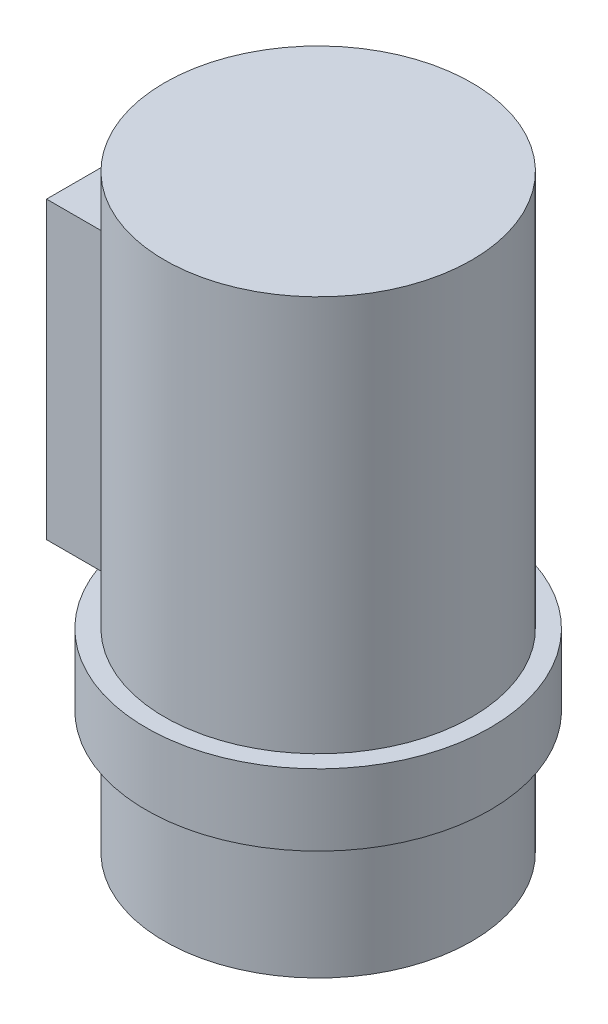
ISO-10303-21;
HEADER;
FILE_DESCRIPTION(('STEP AP214'),'2;1');
FILE_NAME('part.step','',(''),(''),'','','');
FILE_SCHEMA(('AUTOMOTIVE_DESIGN { 1 0 10303 214 1 1 1 1 }'));
ENDSEC;
DATA;
#1=APPLICATION_CONTEXT('core data for automotive mechanical design processes');
#2=APPLICATION_PROTOCOL_DEFINITION('international standard','automotive_design',2000,#1);
#3=PRODUCT_CONTEXT('',#1,'mechanical');
#4=PRODUCT('Part','Part','',(#3));
#5=PRODUCT_RELATED_PRODUCT_CATEGORY('part','',(#4));
#6=PRODUCT_DEFINITION_FORMATION('','',#4);
#7=PRODUCT_DEFINITION_CONTEXT('part definition',#1,'design');
#8=PRODUCT_DEFINITION('design','',#6,#7);
#9=PRODUCT_DEFINITION_SHAPE('','',#8);
#10=(LENGTH_UNIT() NAMED_UNIT(*) SI_UNIT(.MILLI.,.METRE.));
#11=(NAMED_UNIT(*) PLANE_ANGLE_UNIT() SI_UNIT($,.RADIAN.));
#12=(NAMED_UNIT(*) SI_UNIT($,.STERADIAN.) SOLID_ANGLE_UNIT());
#13=UNCERTAINTY_MEASURE_WITH_UNIT(LENGTH_MEASURE(1.E-05),#10,'distance_accuracy_value','');
#14=(GEOMETRIC_REPRESENTATION_CONTEXT(3) GLOBAL_UNCERTAINTY_ASSIGNED_CONTEXT((#13)) GLOBAL_UNIT_ASSIGNED_CONTEXT((#10,
#11,#12)) REPRESENTATION_CONTEXT('',''));
#15=CARTESIAN_POINT('',(0.,0.,0.));
#16=DIRECTION('',(0.,0.,1.));
#17=DIRECTION('',(1.,0.,0.));
#18=AXIS2_PLACEMENT_3D('',#15,#16,#17);
#19=CARTESIAN_POINT('',(0.,0.,0.));
#20=DIRECTION('',(0.,1.,0.));
#21=DIRECTION('',(1.,0.,0.));
#22=AXIS2_PLACEMENT_3D('',#19,#20,#21);
#23=PLANE('',#22);
#24=CARTESIAN_POINT('',(0.,0.,0.));
#25=DIRECTION('',(0.,1.,0.));
#26=DIRECTION('',(-1.,0.,0.));
#27=AXIS2_PLACEMENT_3D('',#24,#25,#26);
#28=CIRCLE('',#27,6.25);
#29=CARTESIAN_POINT('',(6.25,0.,0.));
#30=VERTEX_POINT('',#29);
#31=EDGE_CURVE('E11',#30,#30,#28,.T.);
#32=ORIENTED_EDGE('',*,*,#31,.F.);
#33=EDGE_LOOP('',(#32));
#34=FACE_BOUND('',#33,.T.);
#35=ADVANCED_FACE('F17',(#34),#23,.F.);
#36=CARTESIAN_POINT('',(0.,0.,0.));
#37=DIRECTION('',(0.,1.,0.));
#38=DIRECTION('',(-1.,0.,0.));
#39=AXIS2_PLACEMENT_3D('',#36,#37,#38);
#40=CYLINDRICAL_SURFACE('',#39,6.25);
#41=CARTESIAN_POINT('',(0.,5.,0.));
#42=DIRECTION('',(0.,1.,0.));
#43=DIRECTION('',(-1.,0.,0.));
#44=AXIS2_PLACEMENT_3D('',#41,#42,#43);
#45=CIRCLE('',#44,6.25);
#46=CARTESIAN_POINT('',(6.25,5.,0.));
#47=VERTEX_POINT('',#46);
#48=EDGE_CURVE('E180',#47,#47,#45,.T.);
#49=ORIENTED_EDGE('',*,*,#48,.F.);
#50=DIRECTION('',(0.,-1.,0.));
#51=VECTOR('',#50,1.);
#52=CARTESIAN_POINT('',(6.25,0.,0.));
#53=LINE('',#52,#51);
#54=EDGE_CURVE('E27',#47,#30,#53,.T.);
#55=ORIENTED_EDGE('',*,*,#54,.T.);
#56=ORIENTED_EDGE('',*,*,#31,.T.);
#57=ORIENTED_EDGE('',*,*,#54,.F.);
#58=EDGE_LOOP('',(#49,#55,#56,#57));
#59=FACE_BOUND('',#58,.T.);
#60=ADVANCED_FACE('F230',(#59),#40,.T.);
#61=CARTESIAN_POINT('',(0.,7.9,0.));
#62=DIRECTION('',(0.,1.,0.));
#63=DIRECTION('',(1.,0.,0.));
#64=AXIS2_PLACEMENT_3D('',#61,#62,#63);
#65=PLANE('',#64);
#66=CARTESIAN_POINT('',(0.,7.9,0.));
#67=DIRECTION('',(0.,-1.,0.));
#68=DIRECTION('',(1.,0.,0.));
#69=AXIS2_PLACEMENT_3D('',#66,#67,#68);
#70=CIRCLE('',#69,6.25);
#71=CARTESIAN_POINT('',(-6.25,7.9,0.));
#72=VERTEX_POINT('',#71);
#73=EDGE_CURVE('E169',#72,#72,#70,.T.);
#74=ORIENTED_EDGE('',*,*,#73,.T.);
#75=EDGE_LOOP('',(#74));
#76=FACE_BOUND('',#75,.T.);
#77=CARTESIAN_POINT('',(0.,7.9,0.));
#78=DIRECTION('',(0.,1.,0.));
#79=DIRECTION('',(1.,0.,0.));
#80=AXIS2_PLACEMENT_3D('',#77,#78,#79);
#81=CIRCLE('',#80,7.);
#82=CARTESIAN_POINT('',(-7.,7.9,0.));
#83=VERTEX_POINT('',#82);
#84=EDGE_CURVE('E176',#83,#83,#81,.T.);
#85=ORIENTED_EDGE('',*,*,#84,.T.);
#86=EDGE_LOOP('',(#85));
#87=FACE_BOUND('',#86,.T.);
#88=ADVANCED_FACE('F225',(#76,#87),#65,.T.);
#89=CARTESIAN_POINT('',(0.,5.,0.));
#90=DIRECTION('',(0.,1.,0.));
#91=DIRECTION('',(1.,0.,0.));
#92=AXIS2_PLACEMENT_3D('',#89,#90,#91);
#93=CYLINDRICAL_SURFACE('',#92,7.);
#94=ORIENTED_EDGE('',*,*,#84,.F.);
#95=DIRECTION('',(0.,-1.,0.));
#96=VECTOR('',#95,1.);
#97=CARTESIAN_POINT('',(-7.,5.,0.));
#98=LINE('',#97,#96);
#99=CARTESIAN_POINT('',(-7.,5.,0.));
#100=VERTEX_POINT('',#99);
#101=EDGE_CURVE('E154',#83,#100,#98,.T.);
#102=ORIENTED_EDGE('',*,*,#101,.T.);
#103=CARTESIAN_POINT('',(0.,5.,0.));
#104=DIRECTION('',(0.,1.,0.));
#105=DIRECTION('',(1.,0.,0.));
#106=AXIS2_PLACEMENT_3D('',#103,#104,#105);
#107=CIRCLE('',#106,7.);
#108=EDGE_CURVE('E175',#100,#100,#107,.T.);
#109=ORIENTED_EDGE('',*,*,#108,.T.);
#110=ORIENTED_EDGE('',*,*,#101,.F.);
#111=EDGE_LOOP('',(#94,#102,#109,#110));
#112=FACE_BOUND('',#111,.T.);
#113=ADVANCED_FACE('F212',(#112),#93,.T.);
#114=CARTESIAN_POINT('',(0.,5.,0.));
#115=DIRECTION('',(0.,1.,0.));
#116=DIRECTION('',(1.,0.,0.));
#117=AXIS2_PLACEMENT_3D('',#114,#115,#116);
#118=PLANE('',#117);
#119=ORIENTED_EDGE('',*,*,#48,.T.);
#120=EDGE_LOOP('',(#119));
#121=FACE_BOUND('',#120,.T.);
#122=ORIENTED_EDGE('',*,*,#108,.F.);
#123=EDGE_LOOP('',(#122));
#124=FACE_BOUND('',#123,.T.);
#125=ADVANCED_FACE('F214',(#121,#124),#118,.F.);
#126=CARTESIAN_POINT('',(0.,7.9,0.));
#127=DIRECTION('',(0.,1.,0.));
#128=DIRECTION('',(1.,0.,0.));
#129=AXIS2_PLACEMENT_3D('',#126,#127,#128);
#130=CYLINDRICAL_SURFACE('',#129,6.25);
#131=CARTESIAN_POINT('',(0.,24.,0.));
#132=DIRECTION('',(0.,1.,0.));
#133=DIRECTION('',(1.,0.,0.));
#134=AXIS2_PLACEMENT_3D('',#131,#132,#133);
#135=CIRCLE('',#134,6.25);
#136=CARTESIAN_POINT('',(-6.25,24.,0.));
#137=VERTEX_POINT('',#136);
#138=EDGE_CURVE('E195',#137,#137,#135,.T.);
#139=ORIENTED_EDGE('',*,*,#138,.F.);
#140=DIRECTION('',(0.,-1.,0.));
#141=VECTOR('',#140,1.);
#142=CARTESIAN_POINT('',(-6.25,7.9,0.));
#143=LINE('',#142,#141);
#144=CARTESIAN_POINT('',(-6.25,20.,0.));
#145=VERTEX_POINT('',#144);
#146=EDGE_CURVE('E156',#137,#145,#143,.T.);
#147=ORIENTED_EDGE('',*,*,#146,.T.);
#148=CARTESIAN_POINT('',(0.,20.,0.));
#149=DIRECTION('',(0.,-1.,0.));
#150=DIRECTION('',(1.,0.,0.));
#151=AXIS2_PLACEMENT_3D('',#148,#149,#150);
#152=CIRCLE('',#151,6.25);
#153=CARTESIAN_POINT('',(-5.7282196186948,20.,2.5));
#154=VERTEX_POINT('',#153);
#155=EDGE_CURVE('E189',#154,#145,#152,.T.);
#156=ORIENTED_EDGE('',*,*,#155,.F.);
#157=DIRECTION('',(0.,1.,0.));
#158=VECTOR('',#157,1.);
#159=CARTESIAN_POINT('',(-5.7282196186948,8.,2.5));
#160=LINE('',#159,#158);
#161=CARTESIAN_POINT('',(-5.7282196186948,8.,2.5));
#162=VERTEX_POINT('',#161);
#163=EDGE_CURVE('E113',#162,#154,#160,.T.);
#164=ORIENTED_EDGE('',*,*,#163,.F.);
#165=CARTESIAN_POINT('',(0.,8.,0.));
#166=DIRECTION('',(0.,1.,0.));
#167=DIRECTION('',(1.,0.,0.));
#168=AXIS2_PLACEMENT_3D('',#165,#166,#167);
#169=CIRCLE('',#168,6.25);
#170=CARTESIAN_POINT('',(-6.25,8.,0.));
#171=VERTEX_POINT('',#170);
#172=EDGE_CURVE('E118',#171,#162,#169,.T.);
#173=ORIENTED_EDGE('',*,*,#172,.F.);
#174=DIRECTION('',(0.,-1.,0.));
#175=VECTOR('',#174,1.);
#176=CARTESIAN_POINT('',(-6.25,7.9,0.));
#177=LINE('',#176,#175);
#178=EDGE_CURVE('E160',#171,#72,#177,.T.);
#179=ORIENTED_EDGE('',*,*,#178,.T.);
#180=ORIENTED_EDGE('',*,*,#73,.F.);
#181=ORIENTED_EDGE('',*,*,#178,.F.);
#182=CARTESIAN_POINT('',(0.,8.,0.));
#183=DIRECTION('',(0.,1.,0.));
#184=DIRECTION('',(1.,0.,0.));
#185=AXIS2_PLACEMENT_3D('',#182,#183,#184);
#186=CIRCLE('',#185,6.25);
#187=CARTESIAN_POINT('',(-5.7282196186948,8.,-2.5));
#188=VERTEX_POINT('',#187);
#189=EDGE_CURVE('E136',#188,#171,#186,.T.);
#190=ORIENTED_EDGE('',*,*,#189,.F.);
#191=DIRECTION('',(0.,1.,0.));
#192=VECTOR('',#191,1.);
#193=CARTESIAN_POINT('',(-5.7282196186948,8.,-2.5));
#194=LINE('',#193,#192);
#195=CARTESIAN_POINT('',(-5.7282196186948,20.,-2.5));
#196=VERTEX_POINT('',#195);
#197=EDGE_CURVE('E133',#188,#196,#194,.T.);
#198=ORIENTED_EDGE('',*,*,#197,.T.);
#199=CARTESIAN_POINT('',(0.,20.,0.));
#200=DIRECTION('',(0.,-1.,0.));
#201=DIRECTION('',(1.,0.,0.));
#202=AXIS2_PLACEMENT_3D('',#199,#200,#201);
#203=CIRCLE('',#202,6.25);
#204=EDGE_CURVE('E185',#145,#196,#203,.T.);
#205=ORIENTED_EDGE('',*,*,#204,.F.);
#206=ORIENTED_EDGE('',*,*,#146,.F.);
#207=EDGE_LOOP('',(#139,#147,#156,#164,#173,#179,#180,#181,#190,#198,#205,#206));
#208=FACE_BOUND('',#207,.T.);
#209=ADVANCED_FACE('F216',(#208),#130,.T.);
#210=CARTESIAN_POINT('',(-1.15,8.,0.));
#211=DIRECTION('',(0.,1.,0.));
#212=DIRECTION('',(1.,0.,0.));
#213=AXIS2_PLACEMENT_3D('',#210,#211,#212);
#214=PLANE('',#213);
#215=ORIENTED_EDGE('',*,*,#189,.T.);
#216=ORIENTED_EDGE('',*,*,#172,.T.);
#217=DIRECTION('',(1.,0.,0.));
#218=VECTOR('',#217,1.);
#219=CARTESIAN_POINT('',(-8.55,8.,2.5));
#220=LINE('',#219,#218);
#221=CARTESIAN_POINT('',(-8.55,8.,2.5));
#222=VERTEX_POINT('',#221);
#223=EDGE_CURVE('E108',#222,#162,#220,.T.);
#224=ORIENTED_EDGE('',*,*,#223,.F.);
#225=DIRECTION('',(0.,0.,1.));
#226=VECTOR('',#225,1.);
#227=CARTESIAN_POINT('',(-8.55,8.,-2.5));
#228=LINE('',#227,#226);
#229=CARTESIAN_POINT('',(-8.55,8.,-2.5));
#230=VERTEX_POINT('',#229);
#231=EDGE_CURVE('E92',#230,#222,#228,.T.);
#232=ORIENTED_EDGE('',*,*,#231,.F.);
#233=DIRECTION('',(-1.,0.,0.));
#234=VECTOR('',#233,1.);
#235=CARTESIAN_POINT('',(-5.7282196186948,8.,-2.5));
#236=LINE('',#235,#234);
#237=EDGE_CURVE('E137',#188,#230,#236,.T.);
#238=ORIENTED_EDGE('',*,*,#237,.F.);
#239=EDGE_LOOP('',(#215,#216,#224,#232,#238));
#240=FACE_BOUND('',#239,.T.);
#241=ADVANCED_FACE('F116',(#240),#214,.F.);
#242=CARTESIAN_POINT('',(-5.7282196186948,8.,-2.5));
#243=DIRECTION('',(0.,0.,-1.));
#244=DIRECTION('',(0.,-1.,0.));
#245=AXIS2_PLACEMENT_3D('',#242,#243,#244);
#246=PLANE('',#245);
#247=ORIENTED_EDGE('',*,*,#237,.T.);
#248=DIRECTION('',(0.,1.,0.));
#249=VECTOR('',#248,1.);
#250=CARTESIAN_POINT('',(-8.55,8.,-2.5));
#251=LINE('',#250,#249);
#252=CARTESIAN_POINT('',(-8.55,20.,-2.5));
#253=VERTEX_POINT('',#252);
#254=EDGE_CURVE('E99',#230,#253,#251,.T.);
#255=ORIENTED_EDGE('',*,*,#254,.T.);
#256=DIRECTION('',(-1.,0.,0.));
#257=VECTOR('',#256,1.);
#258=CARTESIAN_POINT('',(-5.7282196186948,20.,-2.5));
#259=LINE('',#258,#257);
#260=EDGE_CURVE('E131',#196,#253,#259,.T.);
#261=ORIENTED_EDGE('',*,*,#260,.F.);
#262=ORIENTED_EDGE('',*,*,#197,.F.);
#263=EDGE_LOOP('',(#247,#255,#261,#262));
#264=FACE_BOUND('',#263,.T.);
#265=ADVANCED_FACE('F240',(#264),#246,.T.);
#266=CARTESIAN_POINT('',(-8.55,8.,-2.5));
#267=DIRECTION('',(-1.,0.,0.));
#268=DIRECTION('',(0.,0.,1.));
#269=AXIS2_PLACEMENT_3D('',#266,#267,#268);
#270=PLANE('',#269);
#271=ORIENTED_EDGE('',*,*,#231,.T.);
#272=DIRECTION('',(0.,1.,0.));
#273=VECTOR('',#272,1.);
#274=CARTESIAN_POINT('',(-8.55,8.,2.5));
#275=LINE('',#274,#273);
#276=CARTESIAN_POINT('',(-8.55,20.,2.5));
#277=VERTEX_POINT('',#276);
#278=EDGE_CURVE('E96',#222,#277,#275,.T.);
#279=ORIENTED_EDGE('',*,*,#278,.T.);
#280=DIRECTION('',(0.,0.,1.));
#281=VECTOR('',#280,1.);
#282=CARTESIAN_POINT('',(-8.55,20.,-2.5));
#283=LINE('',#282,#281);
#284=EDGE_CURVE('E128',#253,#277,#283,.T.);
#285=ORIENTED_EDGE('',*,*,#284,.F.);
#286=ORIENTED_EDGE('',*,*,#254,.F.);
#287=EDGE_LOOP('',(#271,#279,#285,#286));
#288=FACE_BOUND('',#287,.T.);
#289=ADVANCED_FACE('F94',(#288),#270,.T.);
#290=CARTESIAN_POINT('',(-8.55,8.,2.5));
#291=DIRECTION('',(0.,0.,1.));
#292=DIRECTION('',(1.,0.,0.));
#293=AXIS2_PLACEMENT_3D('',#290,#291,#292);
#294=PLANE('',#293);
#295=ORIENTED_EDGE('',*,*,#223,.T.);
#296=ORIENTED_EDGE('',*,*,#163,.T.);
#297=DIRECTION('',(1.,0.,0.));
#298=VECTOR('',#297,1.);
#299=CARTESIAN_POINT('',(-8.55,20.,2.5));
#300=LINE('',#299,#298);
#301=EDGE_CURVE('E110',#277,#154,#300,.T.);
#302=ORIENTED_EDGE('',*,*,#301,.F.);
#303=ORIENTED_EDGE('',*,*,#278,.F.);
#304=EDGE_LOOP('',(#295,#296,#302,#303));
#305=FACE_BOUND('',#304,.T.);
#306=ADVANCED_FACE('F107',(#305),#294,.T.);
#307=CARTESIAN_POINT('',(-1.15,20.,0.));
#308=DIRECTION('',(0.,1.,0.));
#309=DIRECTION('',(1.,0.,0.));
#310=AXIS2_PLACEMENT_3D('',#307,#308,#309);
#311=PLANE('',#310);
#312=ORIENTED_EDGE('',*,*,#155,.T.);
#313=ORIENTED_EDGE('',*,*,#204,.T.);
#314=ORIENTED_EDGE('',*,*,#260,.T.);
#315=ORIENTED_EDGE('',*,*,#284,.T.);
#316=ORIENTED_EDGE('',*,*,#301,.T.);
#317=EDGE_LOOP('',(#312,#313,#314,#315,#316));
#318=FACE_BOUND('',#317,.T.);
#319=ADVANCED_FACE('F19',(#318),#311,.T.);
#320=CARTESIAN_POINT('',(0.,24.,0.));
#321=DIRECTION('',(0.,1.,0.));
#322=DIRECTION('',(1.,0.,0.));
#323=AXIS2_PLACEMENT_3D('',#320,#321,#322);
#324=PLANE('',#323);
#325=ORIENTED_EDGE('',*,*,#138,.T.);
#326=EDGE_LOOP('',(#325));
#327=FACE_BOUND('',#326,.T.);
#328=ADVANCED_FACE('F241',(#327),#324,.T.);
#329=CLOSED_SHELL('',(#35,#60,#88,#113,#125,#209,#241,#265,#289,#306,#319,#328));
#330=MANIFOLD_SOLID_BREP('B1',#329);
#331=ADVANCED_BREP_SHAPE_REPRESENTATION('',(#18,#330),#14);
#332=SHAPE_DEFINITION_REPRESENTATION(#9,#331);
ENDSEC;
END-ISO-10303-21;
